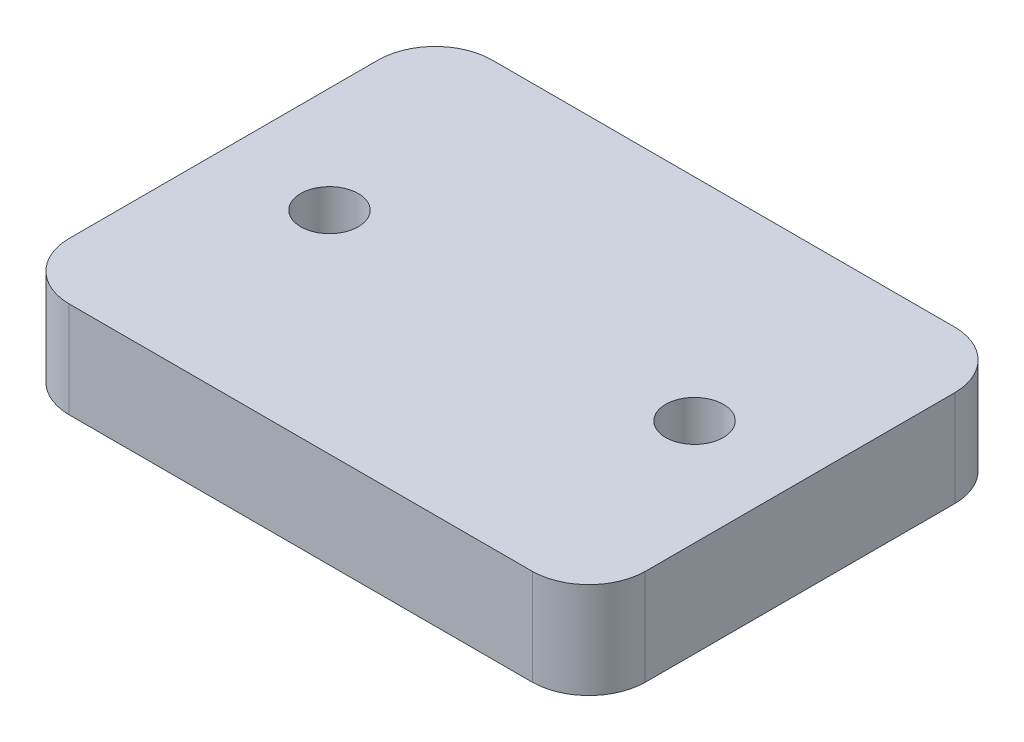
ISO-10303-21;
HEADER;
FILE_DESCRIPTION(('STEP AP214'),'2;1');
FILE_NAME('part.step','',(''),(''),'','','');
FILE_SCHEMA(('AUTOMOTIVE_DESIGN { 1 0 10303 214 1 1 1 1 }'));
ENDSEC;
DATA;
#1=APPLICATION_CONTEXT('core data for automotive mechanical design processes');
#2=APPLICATION_PROTOCOL_DEFINITION('international standard','automotive_design',2000,#1);
#3=PRODUCT_CONTEXT('',#1,'mechanical');
#4=PRODUCT('Part','Part','',(#3));
#5=PRODUCT_RELATED_PRODUCT_CATEGORY('part','',(#4));
#6=PRODUCT_DEFINITION_FORMATION('','',#4);
#7=PRODUCT_DEFINITION_CONTEXT('part definition',#1,'design');
#8=PRODUCT_DEFINITION('design','',#6,#7);
#9=PRODUCT_DEFINITION_SHAPE('','',#8);
#10=(LENGTH_UNIT() NAMED_UNIT(*) SI_UNIT(.MILLI.,.METRE.));
#11=(NAMED_UNIT(*) PLANE_ANGLE_UNIT() SI_UNIT($,.RADIAN.));
#12=(NAMED_UNIT(*) SI_UNIT($,.STERADIAN.) SOLID_ANGLE_UNIT());
#13=UNCERTAINTY_MEASURE_WITH_UNIT(LENGTH_MEASURE(1.E-05),#10,'distance_accuracy_value','');
#14=(GEOMETRIC_REPRESENTATION_CONTEXT(3) GLOBAL_UNCERTAINTY_ASSIGNED_CONTEXT((#13)) GLOBAL_UNIT_ASSIGNED_CONTEXT((#10,
#11,#12)) REPRESENTATION_CONTEXT('',''));
#15=CARTESIAN_POINT('',(0.,0.,0.));
#16=DIRECTION('',(0.,0.,1.));
#17=DIRECTION('',(1.,0.,0.));
#18=AXIS2_PLACEMENT_3D('',#15,#16,#17);
#19=CARTESIAN_POINT('',(-13.2957317073171,5.,0.));
#20=DIRECTION('',(1.,0.,0.));
#21=DIRECTION('',(0.,0.,-1.));
#22=AXIS2_PLACEMENT_3D('',#19,#20,#21);
#23=PLANE('',#22);
#24=DIRECTION('',(0.,0.,1.));
#25=VECTOR('',#24,1.);
#26=CARTESIAN_POINT('',(-13.2957317073171,0.,0.));
#27=LINE('',#26,#25);
#28=CARTESIAN_POINT('',(-13.2957317073171,0.,-1.95822738364079));
#29=VERTEX_POINT('',#28);
#30=CARTESIAN_POINT('',(-13.2957317073171,0.,14.1716420177885));
#31=VERTEX_POINT('',#30);
#32=EDGE_CURVE('E139',#29,#31,#27,.T.);
#33=ORIENTED_EDGE('',*,*,#32,.T.);
#34=DIRECTION('',(0.,-1.,0.));
#35=VECTOR('',#34,1.);
#36=CARTESIAN_POINT('',(-13.2957317073171,5.,14.1716420177885));
#37=LINE('',#36,#35);
#38=CARTESIAN_POINT('',(-13.2957317073171,5.,14.1716420177885));
#39=VERTEX_POINT('',#38);
#40=EDGE_CURVE('E11',#39,#31,#37,.T.);
#41=ORIENTED_EDGE('',*,*,#40,.F.);
#42=DIRECTION('',(0.,0.,1.));
#43=VECTOR('',#42,1.);
#44=CARTESIAN_POINT('',(-13.2957317073171,5.,0.));
#45=LINE('',#44,#43);
#46=CARTESIAN_POINT('',(-13.2957317073171,5.,-1.95822738364079));
#47=VERTEX_POINT('',#46);
#48=EDGE_CURVE('E184',#47,#39,#45,.T.);
#49=ORIENTED_EDGE('',*,*,#48,.F.);
#50=DIRECTION('',(0.,-1.,0.));
#51=VECTOR('',#50,1.);
#52=CARTESIAN_POINT('',(-13.2957317073171,5.,-1.95822738364079));
#53=LINE('',#52,#51);
#54=EDGE_CURVE('E52',#47,#29,#53,.T.);
#55=ORIENTED_EDGE('',*,*,#54,.T.);
#56=EDGE_LOOP('',(#33,#41,#49,#55));
#57=FACE_BOUND('',#56,.T.);
#58=ADVANCED_FACE('F35',(#57),#23,.F.);
#59=CARTESIAN_POINT('',(-10.3265037022165,5.,14.1374793119725));
#60=DIRECTION('',(0.,-1.,0.));
#61=DIRECTION('',(0.,0.,-1.));
#62=AXIS2_PLACEMENT_3D('',#59,#60,#61);
#63=CYLINDRICAL_SURFACE('',#62,2.96942452955829);
#64=CARTESIAN_POINT('',(-10.3265037022165,0.,14.1374793119725));
#65=DIRECTION('',(0.,1.,0.));
#66=DIRECTION('',(0.,0.,1.));
#67=AXIS2_PLACEMENT_3D('',#64,#65,#66);
#68=CIRCLE('',#67,2.96942452955829);
#69=CARTESIAN_POINT('',(-10.3606664080266,0.,17.1067073170732));
#70=VERTEX_POINT('',#69);
#71=EDGE_CURVE('E141',#31,#70,#68,.T.);
#72=ORIENTED_EDGE('',*,*,#71,.T.);
#73=DIRECTION('',(0.,-1.,0.));
#74=VECTOR('',#73,1.);
#75=CARTESIAN_POINT('',(-10.3606664080266,5.,17.1067073170732));
#76=LINE('',#75,#74);
#77=CARTESIAN_POINT('',(-10.3606664080266,5.,17.1067073170732));
#78=VERTEX_POINT('',#77);
#79=EDGE_CURVE('E44',#78,#70,#76,.T.);
#80=ORIENTED_EDGE('',*,*,#79,.F.);
#81=CARTESIAN_POINT('',(-10.3265037022165,5.,14.1374793119725));
#82=DIRECTION('',(0.,1.,0.));
#83=DIRECTION('',(0.,0.,1.));
#84=AXIS2_PLACEMENT_3D('',#81,#82,#83);
#85=CIRCLE('',#84,2.96942452955829);
#86=EDGE_CURVE('E90',#39,#78,#85,.T.);
#87=ORIENTED_EDGE('',*,*,#86,.F.);
#88=ORIENTED_EDGE('',*,*,#40,.T.);
#89=EDGE_LOOP('',(#72,#80,#87,#88));
#90=FACE_BOUND('',#89,.T.);
#91=ADVANCED_FACE('F212',(#90),#63,.T.);
#92=CARTESIAN_POINT('',(0.,5.,17.1067073170732));
#93=DIRECTION('',(0.,0.,-1.));
#94=DIRECTION('',(-1.,0.,0.));
#95=AXIS2_PLACEMENT_3D('',#92,#93,#94);
#96=PLANE('',#95);
#97=DIRECTION('',(1.,0.,0.));
#98=VECTOR('',#97,1.);
#99=CARTESIAN_POINT('',(0.,0.,17.1067073170732));
#100=LINE('',#99,#98);
#101=CARTESIAN_POINT('',(13.7692029933962,0.,17.1067073170732));
#102=VERTEX_POINT('',#101);
#103=EDGE_CURVE('E143',#70,#102,#100,.T.);
#104=ORIENTED_EDGE('',*,*,#103,.T.);
#105=DIRECTION('',(0.,-1.,0.));
#106=VECTOR('',#105,1.);
#107=CARTESIAN_POINT('',(13.7692029933962,5.,17.1067073170732));
#108=LINE('',#107,#106);
#109=CARTESIAN_POINT('',(13.7692029933962,5.,17.1067073170732));
#110=VERTEX_POINT('',#109);
#111=EDGE_CURVE('E164',#110,#102,#108,.T.);
#112=ORIENTED_EDGE('',*,*,#111,.F.);
#113=DIRECTION('',(1.,0.,0.));
#114=VECTOR('',#113,1.);
#115=CARTESIAN_POINT('',(0.,5.,17.1067073170732));
#116=LINE('',#115,#114);
#117=EDGE_CURVE('E171',#78,#110,#116,.T.);
#118=ORIENTED_EDGE('',*,*,#117,.F.);
#119=ORIENTED_EDGE('',*,*,#79,.T.);
#120=EDGE_LOOP('',(#104,#112,#118,#119));
#121=FACE_BOUND('',#120,.T.);
#122=ADVANCED_FACE('F169',(#121),#96,.F.);
#123=CARTESIAN_POINT('',(13.7350402875823,5.,14.1374793119725));
#124=DIRECTION('',(0.,-1.,0.));
#125=DIRECTION('',(0.,0.,-1.));
#126=AXIS2_PLACEMENT_3D('',#123,#124,#125);
#127=CYLINDRICAL_SURFACE('',#126,2.96942452955829);
#128=CARTESIAN_POINT('',(13.7350402875823,0.,14.1374793119725));
#129=DIRECTION('',(0.,1.,0.));
#130=DIRECTION('',(0.,0.,1.));
#131=AXIS2_PLACEMENT_3D('',#128,#129,#130);
#132=CIRCLE('',#131,2.96942452955829);
#133=CARTESIAN_POINT('',(16.7042682926829,0.,14.1716420177853));
#134=VERTEX_POINT('',#133);
#135=EDGE_CURVE('E146',#134,#102,#132,.F.);
#136=ORIENTED_EDGE('',*,*,#135,.F.);
#137=DIRECTION('',(0.,-1.,0.));
#138=VECTOR('',#137,1.);
#139=CARTESIAN_POINT('',(16.7042682926829,5.,14.1716420177853));
#140=LINE('',#139,#138);
#141=CARTESIAN_POINT('',(16.7042682926829,5.,14.1716420177853));
#142=VERTEX_POINT('',#141);
#143=EDGE_CURVE('E162',#142,#134,#140,.T.);
#144=ORIENTED_EDGE('',*,*,#143,.F.);
#145=CARTESIAN_POINT('',(13.7350402875823,5.,14.1374793119725));
#146=DIRECTION('',(0.,1.,0.));
#147=DIRECTION('',(0.,0.,1.));
#148=AXIS2_PLACEMENT_3D('',#145,#146,#147);
#149=CIRCLE('',#148,2.96942452955829);
#150=EDGE_CURVE('E179',#142,#110,#149,.F.);
#151=ORIENTED_EDGE('',*,*,#150,.T.);
#152=ORIENTED_EDGE('',*,*,#111,.T.);
#153=EDGE_LOOP('',(#136,#144,#151,#152));
#154=FACE_BOUND('',#153,.T.);
#155=ADVANCED_FACE('F177',(#154),#127,.T.);
#156=CARTESIAN_POINT('',(16.7042682926829,5.,0.));
#157=DIRECTION('',(1.,0.,0.));
#158=DIRECTION('',(0.,0.,-1.));
#159=AXIS2_PLACEMENT_3D('',#156,#157,#158);
#160=PLANE('',#159);
#161=DIRECTION('',(0.,0.,1.));
#162=VECTOR('',#161,1.);
#163=CARTESIAN_POINT('',(16.7042682926829,0.,0.));
#164=LINE('',#163,#162);
#165=CARTESIAN_POINT('',(16.7042682926829,0.,-1.95822738364087));
#166=VERTEX_POINT('',#165);
#167=EDGE_CURVE('E149',#166,#134,#164,.T.);
#168=ORIENTED_EDGE('',*,*,#167,.F.);
#169=DIRECTION('',(0.,-1.,0.));
#170=VECTOR('',#169,1.);
#171=CARTESIAN_POINT('',(16.7042682926829,5.,-1.95822738364087));
#172=LINE('',#171,#170);
#173=CARTESIAN_POINT('',(16.7042682926829,5.,-1.95822738364087));
#174=VERTEX_POINT('',#173);
#175=EDGE_CURVE('E125',#174,#166,#172,.T.);
#176=ORIENTED_EDGE('',*,*,#175,.F.);
#177=DIRECTION('',(0.,0.,1.));
#178=VECTOR('',#177,1.);
#179=CARTESIAN_POINT('',(16.7042682926829,5.,0.));
#180=LINE('',#179,#178);
#181=EDGE_CURVE('E115',#174,#142,#180,.T.);
#182=ORIENTED_EDGE('',*,*,#181,.T.);
#183=ORIENTED_EDGE('',*,*,#143,.T.);
#184=EDGE_LOOP('',(#168,#176,#182,#183));
#185=FACE_BOUND('',#184,.T.);
#186=ADVANCED_FACE('F223',(#185),#160,.T.);
#187=CARTESIAN_POINT('',(13.7350402875823,5.,-1.9240646778262));
#188=DIRECTION('',(0.,-1.,0.));
#189=DIRECTION('',(0.,0.,-1.));
#190=AXIS2_PLACEMENT_3D('',#187,#188,#189);
#191=CYLINDRICAL_SURFACE('',#190,2.96942452955829);
#192=CARTESIAN_POINT('',(13.7350402875823,0.,-1.9240646778262));
#193=DIRECTION('',(0.,1.,0.));
#194=DIRECTION('',(0.,0.,1.));
#195=AXIS2_PLACEMENT_3D('',#192,#193,#194);
#196=CIRCLE('',#195,2.96942452955829);
#197=CARTESIAN_POINT('',(13.7692029933969,0.,-4.89329268292683));
#198=VERTEX_POINT('',#197);
#199=EDGE_CURVE('E122',#166,#198,#196,.T.);
#200=ORIENTED_EDGE('',*,*,#199,.T.);
#201=DIRECTION('',(0.,-1.,0.));
#202=VECTOR('',#201,1.);
#203=CARTESIAN_POINT('',(13.7692029933969,5.,-4.89329268292683));
#204=LINE('',#203,#202);
#205=CARTESIAN_POINT('',(13.7692029933969,5.,-4.89329268292683));
#206=VERTEX_POINT('',#205);
#207=EDGE_CURVE('E119',#206,#198,#204,.T.);
#208=ORIENTED_EDGE('',*,*,#207,.F.);
#209=CARTESIAN_POINT('',(13.7350402875823,5.,-1.9240646778262));
#210=DIRECTION('',(0.,1.,0.));
#211=DIRECTION('',(0.,0.,1.));
#212=AXIS2_PLACEMENT_3D('',#209,#210,#211);
#213=CIRCLE('',#212,2.96942452955829);
#214=EDGE_CURVE('E107',#174,#206,#213,.T.);
#215=ORIENTED_EDGE('',*,*,#214,.F.);
#216=ORIENTED_EDGE('',*,*,#175,.T.);
#217=EDGE_LOOP('',(#200,#208,#215,#216));
#218=FACE_BOUND('',#217,.T.);
#219=ADVANCED_FACE('F120',(#218),#191,.T.);
#220=CARTESIAN_POINT('',(0.,5.,-4.89329268292683));
#221=DIRECTION('',(0.,0.,-1.));
#222=DIRECTION('',(-1.,0.,0.));
#223=AXIS2_PLACEMENT_3D('',#220,#221,#222);
#224=PLANE('',#223);
#225=DIRECTION('',(1.,0.,0.));
#226=VECTOR('',#225,1.);
#227=CARTESIAN_POINT('',(0.,0.,-4.89329268292683));
#228=LINE('',#227,#226);
#229=CARTESIAN_POINT('',(-10.3606664080311,0.,-4.89329268292683));
#230=VERTEX_POINT('',#229);
#231=EDGE_CURVE('E153',#230,#198,#228,.T.);
#232=ORIENTED_EDGE('',*,*,#231,.F.);
#233=DIRECTION('',(0.,-1.,0.));
#234=VECTOR('',#233,1.);
#235=CARTESIAN_POINT('',(-10.3606664080311,5.,-4.89329268292683));
#236=LINE('',#235,#234);
#237=CARTESIAN_POINT('',(-10.3606664080311,5.,-4.89329268292683));
#238=VERTEX_POINT('',#237);
#239=EDGE_CURVE('E78',#238,#230,#236,.T.);
#240=ORIENTED_EDGE('',*,*,#239,.F.);
#241=DIRECTION('',(1.,0.,0.));
#242=VECTOR('',#241,1.);
#243=CARTESIAN_POINT('',(0.,5.,-4.89329268292683));
#244=LINE('',#243,#242);
#245=EDGE_CURVE('E112',#238,#206,#244,.T.);
#246=ORIENTED_EDGE('',*,*,#245,.T.);
#247=ORIENTED_EDGE('',*,*,#207,.T.);
#248=EDGE_LOOP('',(#232,#240,#246,#247));
#249=FACE_BOUND('',#248,.T.);
#250=ADVANCED_FACE('F127',(#249),#224,.T.);
#251=CARTESIAN_POINT('',(11.2042682926829,5.,6.10670731707317));
#252=DIRECTION('',(0.,-1.,0.));
#253=DIRECTION('',(0.,0.,-1.));
#254=AXIS2_PLACEMENT_3D('',#251,#252,#253);
#255=CYLINDRICAL_SURFACE('',#254,1.5);
#256=CARTESIAN_POINT('',(11.2042682926829,5.,6.10670731707317));
#257=DIRECTION('',(0.,1.,0.));
#258=DIRECTION('',(0.,0.,1.));
#259=AXIS2_PLACEMENT_3D('',#256,#257,#258);
#260=CIRCLE('',#259,1.5);
#261=CARTESIAN_POINT('',(11.2042682926829,5.,7.60670731707317));
#262=VERTEX_POINT('',#261);
#263=EDGE_CURVE('E186',#262,#262,#260,.F.);
#264=ORIENTED_EDGE('',*,*,#263,.F.);
#265=EDGE_LOOP('',(#264));
#266=FACE_BOUND('',#265,.T.);
#267=CARTESIAN_POINT('',(11.2042682926829,0.,6.10670731707317));
#268=DIRECTION('',(0.,1.,0.));
#269=DIRECTION('',(0.,0.,1.));
#270=AXIS2_PLACEMENT_3D('',#267,#268,#269);
#271=CIRCLE('',#270,1.5);
#272=CARTESIAN_POINT('',(11.2042682926829,0.,7.60670731707317));
#273=VERTEX_POINT('',#272);
#274=EDGE_CURVE('E136',#273,#273,#271,.F.);
#275=ORIENTED_EDGE('',*,*,#274,.T.);
#276=EDGE_LOOP('',(#275));
#277=FACE_BOUND('',#276,.T.);
#278=ADVANCED_FACE('F200',(#266,#277),#255,.F.);
#279=CARTESIAN_POINT('',(-7.79573170731708,5.,6.10670731707317));
#280=DIRECTION('',(0.,-1.,0.));
#281=DIRECTION('',(0.,0.,-1.));
#282=AXIS2_PLACEMENT_3D('',#279,#280,#281);
#283=CYLINDRICAL_SURFACE('',#282,1.5);
#284=CARTESIAN_POINT('',(-7.79573170731708,5.,6.10670731707317));
#285=DIRECTION('',(0.,1.,0.));
#286=DIRECTION('',(0.,0.,1.));
#287=AXIS2_PLACEMENT_3D('',#284,#285,#286);
#288=CIRCLE('',#287,1.5);
#289=CARTESIAN_POINT('',(-7.79573170731708,5.,7.60670731707317));
#290=VERTEX_POINT('',#289);
#291=EDGE_CURVE('E158',#290,#290,#288,.T.);
#292=ORIENTED_EDGE('',*,*,#291,.T.);
#293=EDGE_LOOP('',(#292));
#294=FACE_BOUND('',#293,.T.);
#295=CARTESIAN_POINT('',(-7.79573170731708,0.,6.10670731707317));
#296=DIRECTION('',(0.,1.,0.));
#297=DIRECTION('',(0.,0.,1.));
#298=AXIS2_PLACEMENT_3D('',#295,#296,#297);
#299=CIRCLE('',#298,1.5);
#300=CARTESIAN_POINT('',(-7.79573170731708,0.,7.60670731707317));
#301=VERTEX_POINT('',#300);
#302=EDGE_CURVE('E133',#301,#301,#299,.T.);
#303=ORIENTED_EDGE('',*,*,#302,.F.);
#304=EDGE_LOOP('',(#303));
#305=FACE_BOUND('',#304,.T.);
#306=ADVANCED_FACE('F37',(#294,#305),#283,.F.);
#307=CARTESIAN_POINT('',(-10.3265037022164,5.,-1.9240646778262));
#308=DIRECTION('',(0.,-1.,0.));
#309=DIRECTION('',(0.,0.,-1.));
#310=AXIS2_PLACEMENT_3D('',#307,#308,#309);
#311=CYLINDRICAL_SURFACE('',#310,2.96942452955829);
#312=CARTESIAN_POINT('',(-10.3265037022164,0.,-1.9240646778262));
#313=DIRECTION('',(0.,1.,0.));
#314=DIRECTION('',(0.,0.,1.));
#315=AXIS2_PLACEMENT_3D('',#312,#313,#314);
#316=CIRCLE('',#315,2.96942452955829);
#317=EDGE_CURVE('E155',#29,#230,#316,.F.);
#318=ORIENTED_EDGE('',*,*,#317,.F.);
#319=ORIENTED_EDGE('',*,*,#54,.F.);
#320=CARTESIAN_POINT('',(-10.3265037022164,5.,-1.9240646778262));
#321=DIRECTION('',(0.,1.,0.));
#322=DIRECTION('',(0.,0.,1.));
#323=AXIS2_PLACEMENT_3D('',#320,#321,#322);
#324=CIRCLE('',#323,2.96942452955829);
#325=EDGE_CURVE('E128',#47,#238,#324,.F.);
#326=ORIENTED_EDGE('',*,*,#325,.T.);
#327=ORIENTED_EDGE('',*,*,#239,.T.);
#328=EDGE_LOOP('',(#318,#319,#326,#327));
#329=FACE_BOUND('',#328,.T.);
#330=ADVANCED_FACE('F196',(#329),#311,.T.);
#331=CARTESIAN_POINT('',(0.,5.,0.));
#332=DIRECTION('',(0.,1.,0.));
#333=DIRECTION('',(0.,0.,1.));
#334=AXIS2_PLACEMENT_3D('',#331,#332,#333);
#335=PLANE('',#334);
#336=ORIENTED_EDGE('',*,*,#291,.F.);
#337=EDGE_LOOP('',(#336));
#338=FACE_BOUND('',#337,.T.);
#339=ORIENTED_EDGE('',*,*,#263,.T.);
#340=EDGE_LOOP('',(#339));
#341=FACE_BOUND('',#340,.T.);
#342=ORIENTED_EDGE('',*,*,#48,.T.);
#343=ORIENTED_EDGE('',*,*,#86,.T.);
#344=ORIENTED_EDGE('',*,*,#117,.T.);
#345=ORIENTED_EDGE('',*,*,#150,.F.);
#346=ORIENTED_EDGE('',*,*,#181,.F.);
#347=ORIENTED_EDGE('',*,*,#214,.T.);
#348=ORIENTED_EDGE('',*,*,#245,.F.);
#349=ORIENTED_EDGE('',*,*,#325,.F.);
#350=EDGE_LOOP('',(#342,#343,#344,#345,#346,#347,#348,#349));
#351=FACE_BOUND('',#350,.T.);
#352=ADVANCED_FACE('F109',(#338,#341,#351),#335,.T.);
#353=CARTESIAN_POINT('',(0.,0.,0.));
#354=DIRECTION('',(0.,1.,0.));
#355=DIRECTION('',(0.,0.,1.));
#356=AXIS2_PLACEMENT_3D('',#353,#354,#355);
#357=PLANE('',#356);
#358=ORIENTED_EDGE('',*,*,#302,.T.);
#359=EDGE_LOOP('',(#358));
#360=FACE_BOUND('',#359,.T.);
#361=ORIENTED_EDGE('',*,*,#274,.F.);
#362=EDGE_LOOP('',(#361));
#363=FACE_BOUND('',#362,.T.);
#364=ORIENTED_EDGE('',*,*,#32,.F.);
#365=ORIENTED_EDGE('',*,*,#317,.T.);
#366=ORIENTED_EDGE('',*,*,#231,.T.);
#367=ORIENTED_EDGE('',*,*,#199,.F.);
#368=ORIENTED_EDGE('',*,*,#167,.T.);
#369=ORIENTED_EDGE('',*,*,#135,.T.);
#370=ORIENTED_EDGE('',*,*,#103,.F.);
#371=ORIENTED_EDGE('',*,*,#71,.F.);
#372=EDGE_LOOP('',(#364,#365,#366,#367,#368,#369,#370,#371));
#373=FACE_BOUND('',#372,.T.);
#374=ADVANCED_FACE('F173',(#360,#363,#373),#357,.F.);
#375=CLOSED_SHELL('',(#58,#91,#122,#155,#186,#219,#250,#278,#306,#330,#352,#374));
#376=MANIFOLD_SOLID_BREP('B2',#375);
#377=ADVANCED_BREP_SHAPE_REPRESENTATION('',(#18,#376),#14);
#378=SHAPE_DEFINITION_REPRESENTATION(#9,#377);
ENDSEC;
END-ISO-10303-21;
